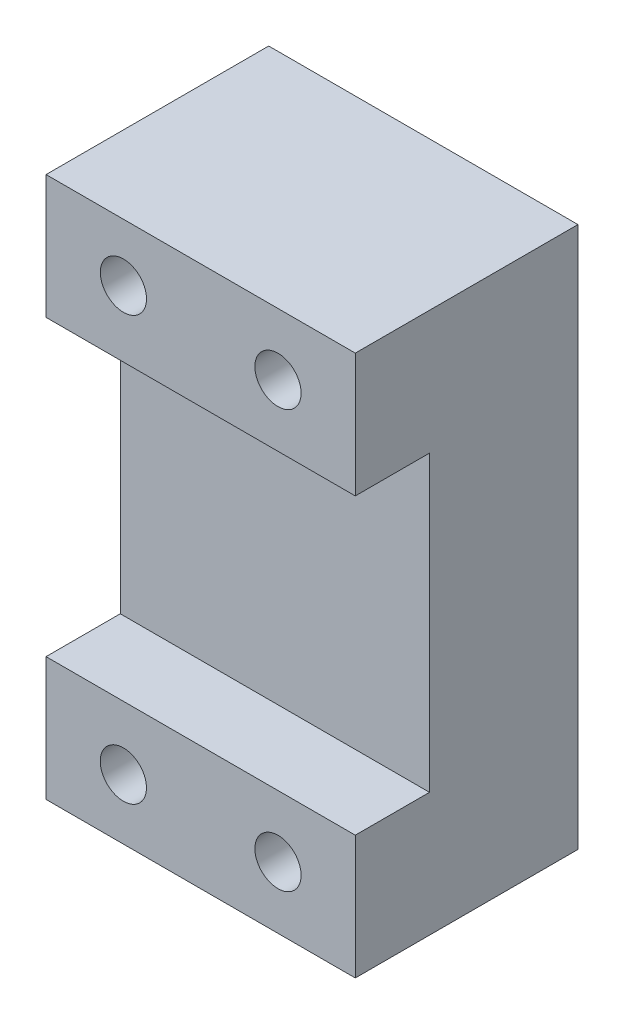
ISO-10303-21;
HEADER;
FILE_DESCRIPTION(('STEP AP214'),'2;1');
FILE_NAME('part.step','',(''),(''),'','','');
FILE_SCHEMA(('AUTOMOTIVE_DESIGN { 1 0 10303 214 1 1 1 1 }'));
ENDSEC;
DATA;
#1=APPLICATION_CONTEXT('core data for automotive mechanical design processes');
#2=APPLICATION_PROTOCOL_DEFINITION('international standard','automotive_design',2000,#1);
#3=PRODUCT_CONTEXT('',#1,'mechanical');
#4=PRODUCT('Part','Part','',(#3));
#5=PRODUCT_RELATED_PRODUCT_CATEGORY('part','',(#4));
#6=PRODUCT_DEFINITION_FORMATION('','',#4);
#7=PRODUCT_DEFINITION_CONTEXT('part definition',#1,'design');
#8=PRODUCT_DEFINITION('design','',#6,#7);
#9=PRODUCT_DEFINITION_SHAPE('','',#8);
#10=(LENGTH_UNIT() NAMED_UNIT(*) SI_UNIT(.MILLI.,.METRE.));
#11=(NAMED_UNIT(*) PLANE_ANGLE_UNIT() SI_UNIT($,.RADIAN.));
#12=(NAMED_UNIT(*) SI_UNIT($,.STERADIAN.) SOLID_ANGLE_UNIT());
#13=UNCERTAINTY_MEASURE_WITH_UNIT(LENGTH_MEASURE(1.E-05),#10,'distance_accuracy_value','');
#14=(GEOMETRIC_REPRESENTATION_CONTEXT(3) GLOBAL_UNCERTAINTY_ASSIGNED_CONTEXT((#13)) GLOBAL_UNIT_ASSIGNED_CONTEXT((#10,
#11,#12)) REPRESENTATION_CONTEXT('',''));
#15=CARTESIAN_POINT('',(0.,0.,0.));
#16=DIRECTION('',(0.,0.,1.));
#17=DIRECTION('',(1.,0.,0.));
#18=AXIS2_PLACEMENT_3D('',#15,#16,#17);
#19=CARTESIAN_POINT('',(0.,0.,18.288));
#20=DIRECTION('',(0.,0.,-1.));
#21=DIRECTION('',(-1.,0.,0.));
#22=AXIS2_PLACEMENT_3D('',#19,#20,#21);
#23=PLANE('',#22);
#24=CARTESIAN_POINT('',(19.05,39.37,18.288));
#25=DIRECTION('',(0.,0.,-1.));
#26=DIRECTION('',(-1.,0.,0.));
#27=AXIS2_PLACEMENT_3D('',#24,#25,#26);
#28=CIRCLE('',#27,1.89864999999999);
#29=CARTESIAN_POINT('',(17.15135,39.37,18.288));
#30=VERTEX_POINT('',#29);
#31=EDGE_CURVE('E420',#30,#30,#28,.T.);
#32=ORIENTED_EDGE('',*,*,#31,.T.);
#33=EDGE_LOOP('',(#32));
#34=FACE_BOUND('',#33,.T.);
#35=CARTESIAN_POINT('',(6.35501588919079,39.7269011435982,18.288));
#36=DIRECTION('',(0.,0.,-1.));
#37=DIRECTION('',(-1.,0.,0.));
#38=AXIS2_PLACEMENT_3D('',#35,#36,#37);
#39=CIRCLE('',#38,1.89864999999999);
#40=CARTESIAN_POINT('',(4.45636588919079,39.7269011435982,18.288));
#41=VERTEX_POINT('',#40);
#42=EDGE_CURVE('E172',#41,#41,#39,.T.);
#43=ORIENTED_EDGE('',*,*,#42,.T.);
#44=EDGE_LOOP('',(#43));
#45=FACE_BOUND('',#44,.T.);
#46=DIRECTION('',(0.,-1.,0.));
#47=VECTOR('',#46,1.);
#48=CARTESIAN_POINT('',(0.,0.,18.288));
#49=LINE('',#48,#47);
#50=CARTESIAN_POINT('',(0.,44.45,18.288));
#51=VERTEX_POINT('',#50);
#52=CARTESIAN_POINT('',(0.,34.29,18.288));
#53=VERTEX_POINT('',#52);
#54=EDGE_CURVE('E132',#51,#53,#49,.T.);
#55=ORIENTED_EDGE('',*,*,#54,.T.);
#56=DIRECTION('',(-1.,0.,0.));
#57=VECTOR('',#56,1.);
#58=CARTESIAN_POINT('',(0.,34.29,18.288));
#59=LINE('',#58,#57);
#60=CARTESIAN_POINT('',(25.4,34.29,18.288));
#61=VERTEX_POINT('',#60);
#62=EDGE_CURVE('E123',#61,#53,#59,.T.);
#63=ORIENTED_EDGE('',*,*,#62,.F.);
#64=DIRECTION('',(0.,1.,0.));
#65=VECTOR('',#64,1.);
#66=CARTESIAN_POINT('',(25.4,0.,18.288));
#67=LINE('',#66,#65);
#68=CARTESIAN_POINT('',(25.4,44.45,18.288));
#69=VERTEX_POINT('',#68);
#70=EDGE_CURVE('E136',#61,#69,#67,.T.);
#71=ORIENTED_EDGE('',*,*,#70,.T.);
#72=DIRECTION('',(-1.,0.,0.));
#73=VECTOR('',#72,1.);
#74=CARTESIAN_POINT('',(0.,44.45,18.288));
#75=LINE('',#74,#73);
#76=EDGE_CURVE('E57',#69,#51,#75,.T.);
#77=ORIENTED_EDGE('',*,*,#76,.T.);
#78=EDGE_LOOP('',(#55,#63,#71,#77));
#79=FACE_BOUND('',#78,.T.);
#80=ADVANCED_FACE('F33',(#34,#45,#79),#23,.F.);
#81=CARTESIAN_POINT('',(0.,0.,18.288));
#82=DIRECTION('',(1.,0.,0.));
#83=DIRECTION('',(0.,0.,-1.));
#84=AXIS2_PLACEMENT_3D('',#81,#82,#83);
#85=PLANE('',#84);
#86=DIRECTION('',(0.,-1.,0.));
#87=VECTOR('',#86,1.);
#88=CARTESIAN_POINT('',(0.,34.29,12.192));
#89=LINE('',#88,#87);
#90=CARTESIAN_POINT('',(0.,34.29,12.192));
#91=VERTEX_POINT('',#90);
#92=CARTESIAN_POINT('',(0.,10.16,12.192));
#93=VERTEX_POINT('',#92);
#94=EDGE_CURVE('E114',#91,#93,#89,.T.);
#95=ORIENTED_EDGE('',*,*,#94,.F.);
#96=DIRECTION('',(0.,0.,1.));
#97=VECTOR('',#96,1.);
#98=CARTESIAN_POINT('',(0.,34.29,12.192));
#99=LINE('',#98,#97);
#100=EDGE_CURVE('E146',#91,#53,#99,.T.);
#101=ORIENTED_EDGE('',*,*,#100,.T.);
#102=ORIENTED_EDGE('',*,*,#54,.F.);
#103=DIRECTION('',(0.,0.,-1.));
#104=VECTOR('',#103,1.);
#105=CARTESIAN_POINT('',(0.,44.45,18.288));
#106=LINE('',#105,#104);
#107=CARTESIAN_POINT('',(0.,44.45,0.));
#108=VERTEX_POINT('',#107);
#109=EDGE_CURVE('E141',#51,#108,#106,.T.);
#110=ORIENTED_EDGE('',*,*,#109,.T.);
#111=DIRECTION('',(0.,-1.,0.));
#112=VECTOR('',#111,1.);
#113=CARTESIAN_POINT('',(0.,0.,0.));
#114=LINE('',#113,#112);
#115=CARTESIAN_POINT('',(0.,0.,0.));
#116=VERTEX_POINT('',#115);
#117=EDGE_CURVE('E142',#108,#116,#114,.T.);
#118=ORIENTED_EDGE('',*,*,#117,.T.);
#119=DIRECTION('',(0.,0.,-1.));
#120=VECTOR('',#119,1.);
#121=CARTESIAN_POINT('',(0.,0.,18.288));
#122=LINE('',#121,#120);
#123=CARTESIAN_POINT('',(0.,0.,18.288));
#124=VERTEX_POINT('',#123);
#125=EDGE_CURVE('E11',#124,#116,#122,.T.);
#126=ORIENTED_EDGE('',*,*,#125,.F.);
#127=CARTESIAN_POINT('',(0.,10.16,18.288));
#128=VERTEX_POINT('',#127);
#129=EDGE_CURVE('E85',#128,#124,#49,.T.);
#130=ORIENTED_EDGE('',*,*,#129,.F.);
#131=DIRECTION('',(0.,0.,1.));
#132=VECTOR('',#131,1.);
#133=CARTESIAN_POINT('',(0.,10.16,12.192));
#134=LINE('',#133,#132);
#135=EDGE_CURVE('E48',#93,#128,#134,.T.);
#136=ORIENTED_EDGE('',*,*,#135,.F.);
#137=EDGE_LOOP('',(#95,#101,#102,#110,#118,#126,#130,#136));
#138=FACE_BOUND('',#137,.T.);
#139=ADVANCED_FACE('F35',(#138),#85,.F.);
#140=CARTESIAN_POINT('',(0.,0.,18.288));
#141=DIRECTION('',(0.,1.,0.));
#142=DIRECTION('',(0.,0.,1.));
#143=AXIS2_PLACEMENT_3D('',#140,#141,#142);
#144=PLANE('',#143);
#145=DIRECTION('',(1.,0.,0.));
#146=VECTOR('',#145,1.);
#147=CARTESIAN_POINT('',(0.,0.,0.));
#148=LINE('',#147,#146);
#149=CARTESIAN_POINT('',(25.4,0.,0.));
#150=VERTEX_POINT('',#149);
#151=EDGE_CURVE('E145',#116,#150,#148,.T.);
#152=ORIENTED_EDGE('',*,*,#151,.T.);
#153=DIRECTION('',(0.,0.,-1.));
#154=VECTOR('',#153,1.);
#155=CARTESIAN_POINT('',(25.4,0.,18.288));
#156=LINE('',#155,#154);
#157=CARTESIAN_POINT('',(25.4,0.,18.288));
#158=VERTEX_POINT('',#157);
#159=EDGE_CURVE('E41',#158,#150,#156,.T.);
#160=ORIENTED_EDGE('',*,*,#159,.F.);
#161=DIRECTION('',(1.,0.,0.));
#162=VECTOR('',#161,1.);
#163=CARTESIAN_POINT('',(0.,0.,18.288));
#164=LINE('',#163,#162);
#165=EDGE_CURVE('E134',#124,#158,#164,.T.);
#166=ORIENTED_EDGE('',*,*,#165,.F.);
#167=ORIENTED_EDGE('',*,*,#125,.T.);
#168=EDGE_LOOP('',(#152,#160,#166,#167));
#169=FACE_BOUND('',#168,.T.);
#170=ADVANCED_FACE('F196',(#169),#144,.F.);
#171=CARTESIAN_POINT('',(25.4,0.,18.288));
#172=DIRECTION('',(-1.,0.,0.));
#173=DIRECTION('',(0.,0.,1.));
#174=AXIS2_PLACEMENT_3D('',#171,#172,#173);
#175=PLANE('',#174);
#176=ORIENTED_EDGE('',*,*,#70,.F.);
#177=DIRECTION('',(0.,0.,1.));
#178=VECTOR('',#177,1.);
#179=CARTESIAN_POINT('',(25.4,34.29,12.192));
#180=LINE('',#179,#178);
#181=CARTESIAN_POINT('',(25.4,34.29,12.192));
#182=VERTEX_POINT('',#181);
#183=EDGE_CURVE('E127',#182,#61,#180,.T.);
#184=ORIENTED_EDGE('',*,*,#183,.F.);
#185=DIRECTION('',(0.,1.,0.));
#186=VECTOR('',#185,1.);
#187=CARTESIAN_POINT('',(25.4,34.29,12.192));
#188=LINE('',#187,#186);
#189=CARTESIAN_POINT('',(25.4,10.16,12.192));
#190=VERTEX_POINT('',#189);
#191=EDGE_CURVE('E113',#190,#182,#188,.T.);
#192=ORIENTED_EDGE('',*,*,#191,.F.);
#193=DIRECTION('',(0.,0.,1.));
#194=VECTOR('',#193,1.);
#195=CARTESIAN_POINT('',(25.4,10.16,12.192));
#196=LINE('',#195,#194);
#197=CARTESIAN_POINT('',(25.4,10.16,18.288));
#198=VERTEX_POINT('',#197);
#199=EDGE_CURVE('E110',#190,#198,#196,.T.);
#200=ORIENTED_EDGE('',*,*,#199,.T.);
#201=EDGE_CURVE('E137',#158,#198,#67,.T.);
#202=ORIENTED_EDGE('',*,*,#201,.F.);
#203=ORIENTED_EDGE('',*,*,#159,.T.);
#204=DIRECTION('',(0.,1.,0.));
#205=VECTOR('',#204,1.);
#206=CARTESIAN_POINT('',(25.4,0.,0.));
#207=LINE('',#206,#205);
#208=CARTESIAN_POINT('',(25.4,44.45,0.));
#209=VERTEX_POINT('',#208);
#210=EDGE_CURVE('E148',#150,#209,#207,.T.);
#211=ORIENTED_EDGE('',*,*,#210,.T.);
#212=DIRECTION('',(0.,0.,-1.));
#213=VECTOR('',#212,1.);
#214=CARTESIAN_POINT('',(25.4,44.45,18.288));
#215=LINE('',#214,#213);
#216=EDGE_CURVE('E152',#69,#209,#215,.T.);
#217=ORIENTED_EDGE('',*,*,#216,.F.);
#218=EDGE_LOOP('',(#176,#184,#192,#200,#202,#203,#211,#217));
#219=FACE_BOUND('',#218,.T.);
#220=ADVANCED_FACE('F159',(#219),#175,.F.);
#221=CARTESIAN_POINT('',(0.,44.45,18.288));
#222=DIRECTION('',(0.,-1.,0.));
#223=DIRECTION('',(0.,0.,-1.));
#224=AXIS2_PLACEMENT_3D('',#221,#222,#223);
#225=PLANE('',#224);
#226=DIRECTION('',(-1.,0.,0.));
#227=VECTOR('',#226,1.);
#228=CARTESIAN_POINT('',(0.,44.45,0.));
#229=LINE('',#228,#227);
#230=EDGE_CURVE('E78',#209,#108,#229,.T.);
#231=ORIENTED_EDGE('',*,*,#230,.T.);
#232=ORIENTED_EDGE('',*,*,#109,.F.);
#233=ORIENTED_EDGE('',*,*,#76,.F.);
#234=ORIENTED_EDGE('',*,*,#216,.T.);
#235=EDGE_LOOP('',(#231,#232,#233,#234));
#236=FACE_BOUND('',#235,.T.);
#237=ADVANCED_FACE('F166',(#236),#225,.F.);
#238=CARTESIAN_POINT('',(19.05,5.08,18.288));
#239=DIRECTION('',(0.,0.,-1.));
#240=DIRECTION('',(-1.,0.,0.));
#241=AXIS2_PLACEMENT_3D('',#238,#239,#240);
#242=CIRCLE('',#241,1.89864999999999);
#243=CARTESIAN_POINT('',(17.15135,5.08,18.288));
#244=VERTEX_POINT('',#243);
#245=EDGE_CURVE('E207',#244,#244,#242,.T.);
#246=ORIENTED_EDGE('',*,*,#245,.T.);
#247=EDGE_LOOP('',(#246));
#248=FACE_BOUND('',#247,.T.);
#249=CARTESIAN_POINT('',(6.35068273476267,4.94831478121968,18.288));
#250=DIRECTION('',(0.,0.,-1.));
#251=DIRECTION('',(-1.,0.,0.));
#252=AXIS2_PLACEMENT_3D('',#249,#250,#251);
#253=CIRCLE('',#252,1.89864999999999);
#254=CARTESIAN_POINT('',(4.45203273476268,4.94831478121968,18.288));
#255=VERTEX_POINT('',#254);
#256=EDGE_CURVE('E210',#255,#255,#253,.T.);
#257=ORIENTED_EDGE('',*,*,#256,.T.);
#258=EDGE_LOOP('',(#257));
#259=FACE_BOUND('',#258,.T.);
#260=ORIENTED_EDGE('',*,*,#201,.T.);
#261=DIRECTION('',(1.,0.,0.));
#262=VECTOR('',#261,1.);
#263=CARTESIAN_POINT('',(0.,10.16,18.288));
#264=LINE('',#263,#262);
#265=EDGE_CURVE('E170',#128,#198,#264,.T.);
#266=ORIENTED_EDGE('',*,*,#265,.F.);
#267=ORIENTED_EDGE('',*,*,#129,.T.);
#268=ORIENTED_EDGE('',*,*,#165,.T.);
#269=EDGE_LOOP('',(#260,#266,#267,#268));
#270=FACE_BOUND('',#269,.T.);
#271=ADVANCED_FACE('F184',(#248,#259,#270),#23,.F.);
#272=CARTESIAN_POINT('',(0.,0.,0.));
#273=DIRECTION('',(0.,0.,-1.));
#274=DIRECTION('',(-1.,0.,0.));
#275=AXIS2_PLACEMENT_3D('',#272,#273,#274);
#276=PLANE('',#275);
#277=CARTESIAN_POINT('',(19.05,5.08,0.));
#278=DIRECTION('',(0.,0.,-1.));
#279=DIRECTION('',(-1.,0.,0.));
#280=AXIS2_PLACEMENT_3D('',#277,#278,#279);
#281=CIRCLE('',#280,3.96875);
#282=CARTESIAN_POINT('',(15.08125,5.08,0.));
#283=VERTEX_POINT('',#282);
#284=EDGE_CURVE('E393',#283,#283,#281,.T.);
#285=ORIENTED_EDGE('',*,*,#284,.F.);
#286=EDGE_LOOP('',(#285));
#287=FACE_BOUND('',#286,.T.);
#288=CARTESIAN_POINT('',(6.35068273476267,4.94831478121968,0.));
#289=DIRECTION('',(0.,0.,-1.));
#290=DIRECTION('',(-1.,0.,0.));
#291=AXIS2_PLACEMENT_3D('',#288,#289,#290);
#292=CIRCLE('',#291,3.96875);
#293=CARTESIAN_POINT('',(2.38193273476268,4.94831478121968,0.));
#294=VERTEX_POINT('',#293);
#295=EDGE_CURVE('E401',#294,#294,#292,.T.);
#296=ORIENTED_EDGE('',*,*,#295,.F.);
#297=EDGE_LOOP('',(#296));
#298=FACE_BOUND('',#297,.T.);
#299=CARTESIAN_POINT('',(19.05,39.37,0.));
#300=DIRECTION('',(0.,0.,-1.));
#301=DIRECTION('',(-1.,0.,0.));
#302=AXIS2_PLACEMENT_3D('',#299,#300,#301);
#303=CIRCLE('',#302,3.96875);
#304=CARTESIAN_POINT('',(15.08125,39.37,0.));
#305=VERTEX_POINT('',#304);
#306=EDGE_CURVE('E411',#305,#305,#303,.T.);
#307=ORIENTED_EDGE('',*,*,#306,.F.);
#308=EDGE_LOOP('',(#307));
#309=FACE_BOUND('',#308,.T.);
#310=CARTESIAN_POINT('',(6.35501588919079,39.7269011435982,0.));
#311=DIRECTION('',(0.,0.,-1.));
#312=DIRECTION('',(-1.,0.,0.));
#313=AXIS2_PLACEMENT_3D('',#310,#311,#312);
#314=CIRCLE('',#313,3.96875);
#315=CARTESIAN_POINT('',(2.38626588919079,39.7269011435982,0.));
#316=VERTEX_POINT('',#315);
#317=EDGE_CURVE('E422',#316,#316,#314,.T.);
#318=ORIENTED_EDGE('',*,*,#317,.F.);
#319=EDGE_LOOP('',(#318));
#320=FACE_BOUND('',#319,.T.);
#321=ORIENTED_EDGE('',*,*,#117,.F.);
#322=ORIENTED_EDGE('',*,*,#230,.F.);
#323=ORIENTED_EDGE('',*,*,#210,.F.);
#324=ORIENTED_EDGE('',*,*,#151,.F.);
#325=EDGE_LOOP('',(#321,#322,#323,#324));
#326=FACE_BOUND('',#325,.T.);
#327=ADVANCED_FACE('F164',(#287,#298,#309,#320,#326),#276,.T.);
#328=CARTESIAN_POINT('',(0.,34.29,12.192));
#329=DIRECTION('',(0.,1.,0.));
#330=DIRECTION('',(0.,0.,1.));
#331=AXIS2_PLACEMENT_3D('',#328,#329,#330);
#332=PLANE('',#331);
#333=ORIENTED_EDGE('',*,*,#62,.T.);
#334=ORIENTED_EDGE('',*,*,#100,.F.);
#335=DIRECTION('',(-1.,0.,0.));
#336=VECTOR('',#335,1.);
#337=CARTESIAN_POINT('',(0.,34.29,12.192));
#338=LINE('',#337,#336);
#339=EDGE_CURVE('E120',#182,#91,#338,.T.);
#340=ORIENTED_EDGE('',*,*,#339,.F.);
#341=ORIENTED_EDGE('',*,*,#183,.T.);
#342=EDGE_LOOP('',(#333,#334,#340,#341));
#343=FACE_BOUND('',#342,.T.);
#344=ADVANCED_FACE('F175',(#343),#332,.F.);
#345=CARTESIAN_POINT('',(0.,10.16,12.192));
#346=DIRECTION('',(0.,-1.,0.));
#347=DIRECTION('',(0.,0.,-1.));
#348=AXIS2_PLACEMENT_3D('',#345,#346,#347);
#349=PLANE('',#348);
#350=ORIENTED_EDGE('',*,*,#265,.T.);
#351=ORIENTED_EDGE('',*,*,#199,.F.);
#352=DIRECTION('',(1.,0.,0.));
#353=VECTOR('',#352,1.);
#354=CARTESIAN_POINT('',(0.,10.16,12.192));
#355=LINE('',#354,#353);
#356=EDGE_CURVE('E106',#93,#190,#355,.T.);
#357=ORIENTED_EDGE('',*,*,#356,.F.);
#358=ORIENTED_EDGE('',*,*,#135,.T.);
#359=EDGE_LOOP('',(#350,#351,#357,#358));
#360=FACE_BOUND('',#359,.T.);
#361=ADVANCED_FACE('F108',(#360),#349,.F.);
#362=CARTESIAN_POINT('',(0.,0.,12.192));
#363=DIRECTION('',(0.,0.,1.));
#364=DIRECTION('',(1.,0.,0.));
#365=AXIS2_PLACEMENT_3D('',#362,#363,#364);
#366=PLANE('',#365);
#367=ORIENTED_EDGE('',*,*,#94,.T.);
#368=ORIENTED_EDGE('',*,*,#356,.T.);
#369=ORIENTED_EDGE('',*,*,#191,.T.);
#370=ORIENTED_EDGE('',*,*,#339,.T.);
#371=EDGE_LOOP('',(#367,#368,#369,#370));
#372=FACE_BOUND('',#371,.T.);
#373=ADVANCED_FACE('F118',(#372),#366,.T.);
#374=CARTESIAN_POINT('',(6.35501588919079,39.7269011435982,0.));
#375=DIRECTION('',(0.,0.,-1.));
#376=DIRECTION('',(-1.,0.,0.));
#377=AXIS2_PLACEMENT_3D('',#374,#375,#376);
#378=CYLINDRICAL_SURFACE('',#377,1.89865);
#379=ORIENTED_EDGE('',*,*,#42,.F.);
#380=EDGE_LOOP('',(#379));
#381=FACE_BOUND('',#380,.T.);
#382=CARTESIAN_POINT('',(6.35501588919079,39.7269011435982,2.2098));
#383=DIRECTION('',(0.,0.,-1.));
#384=DIRECTION('',(-1.,0.,0.));
#385=AXIS2_PLACEMENT_3D('',#382,#383,#384);
#386=CIRCLE('',#385,1.89865);
#387=CARTESIAN_POINT('',(4.45636588919079,39.7269011435982,2.2098));
#388=VERTEX_POINT('',#387);
#389=EDGE_CURVE('E428',#388,#388,#386,.T.);
#390=ORIENTED_EDGE('',*,*,#389,.T.);
#391=EDGE_LOOP('',(#390));
#392=FACE_BOUND('',#391,.T.);
#393=ADVANCED_FACE('F236',(#381,#392),#378,.F.);
#394=CARTESIAN_POINT('',(8.25366588919079,39.7269011435982,2.2098));
#395=DIRECTION('',(0.,0.,1.));
#396=DIRECTION('',(1.,0.,0.));
#397=AXIS2_PLACEMENT_3D('',#394,#395,#396);
#398=PLANE('',#397);
#399=ORIENTED_EDGE('',*,*,#389,.F.);
#400=EDGE_LOOP('',(#399));
#401=FACE_BOUND('',#400,.T.);
#402=CARTESIAN_POINT('',(6.35501588919079,39.7269011435982,2.2098));
#403=DIRECTION('',(0.,0.,-1.));
#404=DIRECTION('',(-1.,0.,0.));
#405=AXIS2_PLACEMENT_3D('',#402,#403,#404);
#406=CIRCLE('',#405,3.96875);
#407=CARTESIAN_POINT('',(2.38626588919079,39.7269011435982,2.2098));
#408=VERTEX_POINT('',#407);
#409=EDGE_CURVE('E425',#408,#408,#406,.T.);
#410=ORIENTED_EDGE('',*,*,#409,.T.);
#411=EDGE_LOOP('',(#410));
#412=FACE_BOUND('',#411,.T.);
#413=ADVANCED_FACE('F241',(#401,#412),#398,.F.);
#414=CARTESIAN_POINT('',(6.35501588919079,39.7269011435982,0.));
#415=DIRECTION('',(0.,0.,-1.));
#416=DIRECTION('',(-1.,0.,0.));
#417=AXIS2_PLACEMENT_3D('',#414,#415,#416);
#418=CYLINDRICAL_SURFACE('',#417,3.96875);
#419=ORIENTED_EDGE('',*,*,#409,.F.);
#420=EDGE_LOOP('',(#419));
#421=FACE_BOUND('',#420,.T.);
#422=ORIENTED_EDGE('',*,*,#317,.T.);
#423=EDGE_LOOP('',(#422));
#424=FACE_BOUND('',#423,.T.);
#425=ADVANCED_FACE('F253',(#421,#424),#418,.F.);
#426=CARTESIAN_POINT('',(19.05,39.37,0.));
#427=DIRECTION('',(0.,0.,-1.));
#428=DIRECTION('',(-1.,0.,0.));
#429=AXIS2_PLACEMENT_3D('',#426,#427,#428);
#430=CYLINDRICAL_SURFACE('',#429,1.89865);
#431=ORIENTED_EDGE('',*,*,#31,.F.);
#432=EDGE_LOOP('',(#431));
#433=FACE_BOUND('',#432,.T.);
#434=CARTESIAN_POINT('',(19.05,39.37,2.2098));
#435=DIRECTION('',(0.,0.,-1.));
#436=DIRECTION('',(-1.,0.,0.));
#437=AXIS2_PLACEMENT_3D('',#434,#435,#436);
#438=CIRCLE('',#437,1.89865);
#439=CARTESIAN_POINT('',(17.15135,39.37,2.2098));
#440=VERTEX_POINT('',#439);
#441=EDGE_CURVE('E417',#440,#440,#438,.T.);
#442=ORIENTED_EDGE('',*,*,#441,.T.);
#443=EDGE_LOOP('',(#442));
#444=FACE_BOUND('',#443,.T.);
#445=ADVANCED_FACE('F263',(#433,#444),#430,.F.);
#446=CARTESIAN_POINT('',(20.94865,39.37,2.2098));
#447=DIRECTION('',(0.,0.,1.));
#448=DIRECTION('',(1.,0.,0.));
#449=AXIS2_PLACEMENT_3D('',#446,#447,#448);
#450=PLANE('',#449);
#451=ORIENTED_EDGE('',*,*,#441,.F.);
#452=EDGE_LOOP('',(#451));
#453=FACE_BOUND('',#452,.T.);
#454=CARTESIAN_POINT('',(19.05,39.37,2.2098));
#455=DIRECTION('',(0.,0.,-1.));
#456=DIRECTION('',(-1.,0.,0.));
#457=AXIS2_PLACEMENT_3D('',#454,#455,#456);
#458=CIRCLE('',#457,3.96875);
#459=CARTESIAN_POINT('',(15.08125,39.37,2.2098));
#460=VERTEX_POINT('',#459);
#461=EDGE_CURVE('E414',#460,#460,#458,.T.);
#462=ORIENTED_EDGE('',*,*,#461,.T.);
#463=EDGE_LOOP('',(#462));
#464=FACE_BOUND('',#463,.T.);
#465=ADVANCED_FACE('F273',(#453,#464),#450,.F.);
#466=CARTESIAN_POINT('',(19.05,39.37,0.));
#467=DIRECTION('',(0.,0.,-1.));
#468=DIRECTION('',(-1.,0.,0.));
#469=AXIS2_PLACEMENT_3D('',#466,#467,#468);
#470=CYLINDRICAL_SURFACE('',#469,3.96875);
#471=ORIENTED_EDGE('',*,*,#461,.F.);
#472=EDGE_LOOP('',(#471));
#473=FACE_BOUND('',#472,.T.);
#474=ORIENTED_EDGE('',*,*,#306,.T.);
#475=EDGE_LOOP('',(#474));
#476=FACE_BOUND('',#475,.T.);
#477=ADVANCED_FACE('F283',(#473,#476),#470,.F.);
#478=CARTESIAN_POINT('',(6.35068273476267,4.94831478121968,0.));
#479=DIRECTION('',(0.,0.,-1.));
#480=DIRECTION('',(-1.,0.,0.));
#481=AXIS2_PLACEMENT_3D('',#478,#479,#480);
#482=CYLINDRICAL_SURFACE('',#481,1.89865);
#483=ORIENTED_EDGE('',*,*,#256,.F.);
#484=EDGE_LOOP('',(#483));
#485=FACE_BOUND('',#484,.T.);
#486=CARTESIAN_POINT('',(6.35068273476267,4.94831478121968,2.2098));
#487=DIRECTION('',(0.,0.,-1.));
#488=DIRECTION('',(-1.,0.,0.));
#489=AXIS2_PLACEMENT_3D('',#486,#487,#488);
#490=CIRCLE('',#489,1.89865);
#491=CARTESIAN_POINT('',(4.45203273476267,4.94831478121968,2.2098));
#492=VERTEX_POINT('',#491);
#493=EDGE_CURVE('E407',#492,#492,#490,.T.);
#494=ORIENTED_EDGE('',*,*,#493,.T.);
#495=EDGE_LOOP('',(#494));
#496=FACE_BOUND('',#495,.T.);
#497=ADVANCED_FACE('F293',(#485,#496),#482,.F.);
#498=CARTESIAN_POINT('',(8.24933273476267,4.94831478121968,2.2098));
#499=DIRECTION('',(0.,0.,1.));
#500=DIRECTION('',(1.,0.,0.));
#501=AXIS2_PLACEMENT_3D('',#498,#499,#500);
#502=PLANE('',#501);
#503=ORIENTED_EDGE('',*,*,#493,.F.);
#504=EDGE_LOOP('',(#503));
#505=FACE_BOUND('',#504,.T.);
#506=CARTESIAN_POINT('',(6.35068273476267,4.94831478121968,2.2098));
#507=DIRECTION('',(0.,0.,-1.));
#508=DIRECTION('',(-1.,0.,0.));
#509=AXIS2_PLACEMENT_3D('',#506,#507,#508);
#510=CIRCLE('',#509,3.96875);
#511=CARTESIAN_POINT('',(2.38193273476268,4.94831478121968,2.2098));
#512=VERTEX_POINT('',#511);
#513=EDGE_CURVE('E404',#512,#512,#510,.T.);
#514=ORIENTED_EDGE('',*,*,#513,.T.);
#515=EDGE_LOOP('',(#514));
#516=FACE_BOUND('',#515,.T.);
#517=ADVANCED_FACE('F303',(#505,#516),#502,.F.);
#518=CARTESIAN_POINT('',(6.35068273476267,4.94831478121968,0.));
#519=DIRECTION('',(0.,0.,-1.));
#520=DIRECTION('',(-1.,0.,0.));
#521=AXIS2_PLACEMENT_3D('',#518,#519,#520);
#522=CYLINDRICAL_SURFACE('',#521,3.96875);
#523=ORIENTED_EDGE('',*,*,#513,.F.);
#524=EDGE_LOOP('',(#523));
#525=FACE_BOUND('',#524,.T.);
#526=ORIENTED_EDGE('',*,*,#295,.T.);
#527=EDGE_LOOP('',(#526));
#528=FACE_BOUND('',#527,.T.);
#529=ADVANCED_FACE('F313',(#525,#528),#522,.F.);
#530=CARTESIAN_POINT('',(19.05,5.08,0.));
#531=DIRECTION('',(0.,0.,-1.));
#532=DIRECTION('',(-1.,0.,0.));
#533=AXIS2_PLACEMENT_3D('',#530,#531,#532);
#534=CYLINDRICAL_SURFACE('',#533,1.89865);
#535=ORIENTED_EDGE('',*,*,#245,.F.);
#536=EDGE_LOOP('',(#535));
#537=FACE_BOUND('',#536,.T.);
#538=CARTESIAN_POINT('',(19.05,5.08,2.2098));
#539=DIRECTION('',(0.,0.,-1.));
#540=DIRECTION('',(-1.,0.,0.));
#541=AXIS2_PLACEMENT_3D('',#538,#539,#540);
#542=CIRCLE('',#541,1.89865);
#543=CARTESIAN_POINT('',(17.15135,5.08,2.2098));
#544=VERTEX_POINT('',#543);
#545=EDGE_CURVE('E395',#544,#544,#542,.T.);
#546=ORIENTED_EDGE('',*,*,#545,.T.);
#547=EDGE_LOOP('',(#546));
#548=FACE_BOUND('',#547,.T.);
#549=ADVANCED_FACE('F323',(#537,#548),#534,.F.);
#550=CARTESIAN_POINT('',(20.94865,5.08,2.2098));
#551=DIRECTION('',(0.,0.,1.));
#552=DIRECTION('',(1.,0.,0.));
#553=AXIS2_PLACEMENT_3D('',#550,#551,#552);
#554=PLANE('',#553);
#555=ORIENTED_EDGE('',*,*,#545,.F.);
#556=EDGE_LOOP('',(#555));
#557=FACE_BOUND('',#556,.T.);
#558=CARTESIAN_POINT('',(19.05,5.08,2.2098));
#559=DIRECTION('',(0.,0.,-1.));
#560=DIRECTION('',(-1.,0.,0.));
#561=AXIS2_PLACEMENT_3D('',#558,#559,#560);
#562=CIRCLE('',#561,3.96875);
#563=CARTESIAN_POINT('',(15.08125,5.08,2.2098));
#564=VERTEX_POINT('',#563);
#565=EDGE_CURVE('E390',#564,#564,#562,.T.);
#566=ORIENTED_EDGE('',*,*,#565,.T.);
#567=EDGE_LOOP('',(#566));
#568=FACE_BOUND('',#567,.T.);
#569=ADVANCED_FACE('F333',(#557,#568),#554,.F.);
#570=CARTESIAN_POINT('',(19.05,5.08,0.));
#571=DIRECTION('',(0.,0.,-1.));
#572=DIRECTION('',(-1.,0.,0.));
#573=AXIS2_PLACEMENT_3D('',#570,#571,#572);
#574=CYLINDRICAL_SURFACE('',#573,3.96875);
#575=ORIENTED_EDGE('',*,*,#565,.F.);
#576=EDGE_LOOP('',(#575));
#577=FACE_BOUND('',#576,.T.);
#578=ORIENTED_EDGE('',*,*,#284,.T.);
#579=EDGE_LOOP('',(#578));
#580=FACE_BOUND('',#579,.T.);
#581=ADVANCED_FACE('F343',(#577,#580),#574,.F.);
#582=CLOSED_SHELL('',(#80,#139,#170,#220,#237,#271,#327,#344,#361,#373,#393,#413,#425,#445,#465,
#477,#497,#517,#529,#549,#569,#581));
#583=MANIFOLD_SOLID_BREP('B2',#582);
#584=ADVANCED_BREP_SHAPE_REPRESENTATION('',(#18,#583),#14);
#585=SHAPE_DEFINITION_REPRESENTATION(#9,#584);
ENDSEC;
END-ISO-10303-21;
